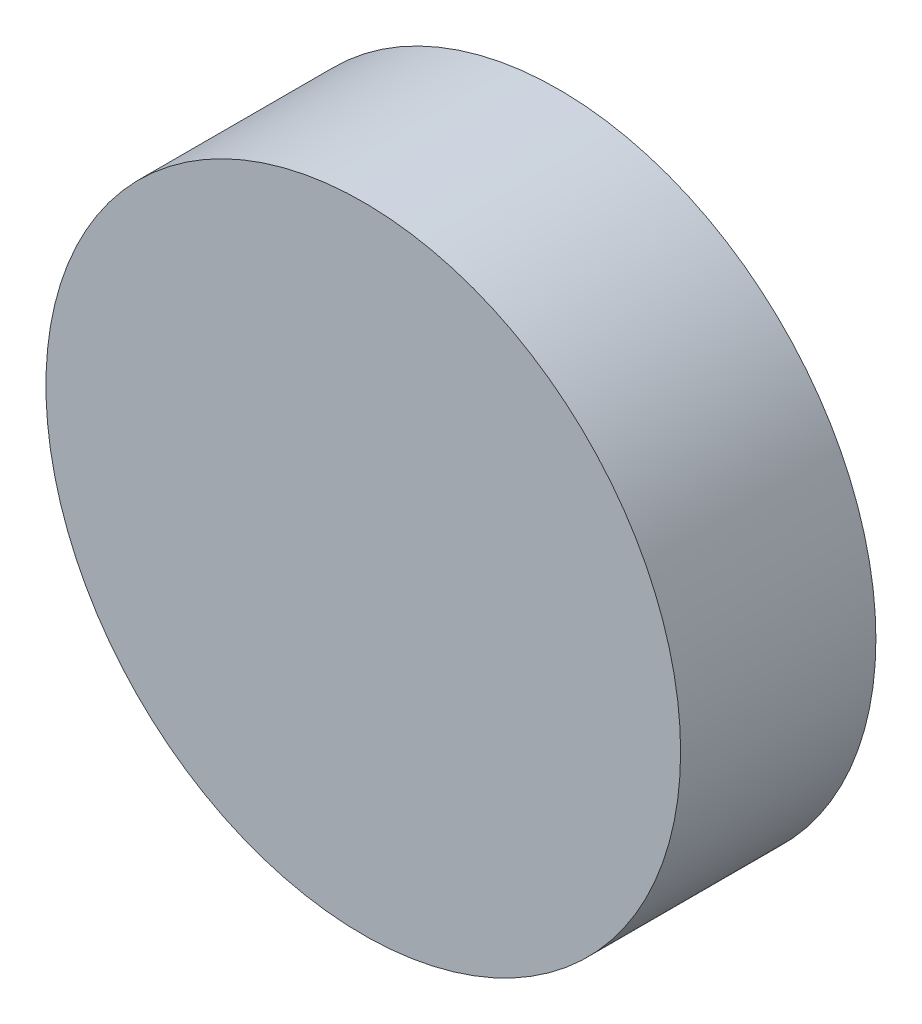
ISO-10303-21;
HEADER;
FILE_DESCRIPTION(('STEP AP214'),'2;1');
FILE_NAME('part.step','',(''),(''),'','','');
FILE_SCHEMA(('AUTOMOTIVE_DESIGN { 1 0 10303 214 1 1 1 1 }'));
ENDSEC;
DATA;
#1=APPLICATION_CONTEXT('core data for automotive mechanical design processes');
#2=APPLICATION_PROTOCOL_DEFINITION('international standard','automotive_design',2000,#1);
#3=PRODUCT_CONTEXT('',#1,'mechanical');
#4=PRODUCT('Part','Part','',(#3));
#5=PRODUCT_RELATED_PRODUCT_CATEGORY('part','',(#4));
#6=PRODUCT_DEFINITION_FORMATION('','',#4);
#7=PRODUCT_DEFINITION_CONTEXT('part definition',#1,'design');
#8=PRODUCT_DEFINITION('design','',#6,#7);
#9=PRODUCT_DEFINITION_SHAPE('','',#8);
#10=(LENGTH_UNIT() NAMED_UNIT(*) SI_UNIT(.MILLI.,.METRE.));
#11=(NAMED_UNIT(*) PLANE_ANGLE_UNIT() SI_UNIT($,.RADIAN.));
#12=(NAMED_UNIT(*) SI_UNIT($,.STERADIAN.) SOLID_ANGLE_UNIT());
#13=UNCERTAINTY_MEASURE_WITH_UNIT(LENGTH_MEASURE(1.E-05),#10,'distance_accuracy_value','');
#14=(GEOMETRIC_REPRESENTATION_CONTEXT(3) GLOBAL_UNCERTAINTY_ASSIGNED_CONTEXT((#13)) GLOBAL_UNIT_ASSIGNED_CONTEXT((#10,
#11,#12)) REPRESENTATION_CONTEXT('',''));
#15=CARTESIAN_POINT('',(0.,0.,0.));
#16=DIRECTION('',(0.,0.,1.));
#17=DIRECTION('',(1.,0.,0.));
#18=AXIS2_PLACEMENT_3D('',#15,#16,#17);
#19=CARTESIAN_POINT('',(0.,0.,5.08));
#20=DIRECTION('',(0.,0.,-1.));
#21=DIRECTION('',(-1.,0.,0.));
#22=AXIS2_PLACEMENT_3D('',#19,#20,#21);
#23=CYLINDRICAL_SURFACE('',#22,8.255);
#24=CARTESIAN_POINT('',(0.,0.,5.08));
#25=DIRECTION('',(0.,0.,1.));
#26=DIRECTION('',(1.,0.,0.));
#27=AXIS2_PLACEMENT_3D('',#24,#25,#26);
#28=CIRCLE('',#27,8.255);
#29=CARTESIAN_POINT('',(8.255,0.,5.08));
#30=VERTEX_POINT('',#29);
#31=EDGE_CURVE('E10',#30,#30,#28,.T.);
#32=ORIENTED_EDGE('',*,*,#31,.F.);
#33=EDGE_LOOP('',(#32));
#34=FACE_BOUND('',#33,.T.);
#35=CARTESIAN_POINT('',(0.,0.,0.));
#36=DIRECTION('',(0.,0.,1.));
#37=DIRECTION('',(1.,0.,0.));
#38=AXIS2_PLACEMENT_3D('',#35,#36,#37);
#39=CIRCLE('',#38,8.255);
#40=CARTESIAN_POINT('',(8.255,0.,0.));
#41=VERTEX_POINT('',#40);
#42=EDGE_CURVE('E34',#41,#41,#39,.T.);
#43=ORIENTED_EDGE('',*,*,#42,.T.);
#44=EDGE_LOOP('',(#43));
#45=FACE_BOUND('',#44,.T.);
#46=ADVANCED_FACE('F31',(#34,#45),#23,.T.);
#47=CARTESIAN_POINT('',(0.,0.,5.08));
#48=DIRECTION('',(0.,0.,1.));
#49=DIRECTION('',(1.,0.,0.));
#50=AXIS2_PLACEMENT_3D('',#47,#48,#49);
#51=PLANE('',#50);
#52=ORIENTED_EDGE('',*,*,#31,.T.);
#53=EDGE_LOOP('',(#52));
#54=FACE_BOUND('',#53,.T.);
#55=ADVANCED_FACE('F46',(#54),#51,.T.);
#56=CARTESIAN_POINT('',(0.,0.,0.));
#57=DIRECTION('',(0.,0.,1.));
#58=DIRECTION('',(1.,0.,0.));
#59=AXIS2_PLACEMENT_3D('',#56,#57,#58);
#60=PLANE('',#59);
#61=ORIENTED_EDGE('',*,*,#42,.F.);
#62=EDGE_LOOP('',(#61));
#63=FACE_BOUND('',#62,.T.);
#64=ADVANCED_FACE('F44',(#63),#60,.F.);
#65=CLOSED_SHELL('',(#46,#55,#64));
#66=MANIFOLD_SOLID_BREP('B2',#65);
#67=ADVANCED_BREP_SHAPE_REPRESENTATION('',(#18,#66),#14);
#68=SHAPE_DEFINITION_REPRESENTATION(#9,#67);
ENDSEC;
END-ISO-10303-21;
